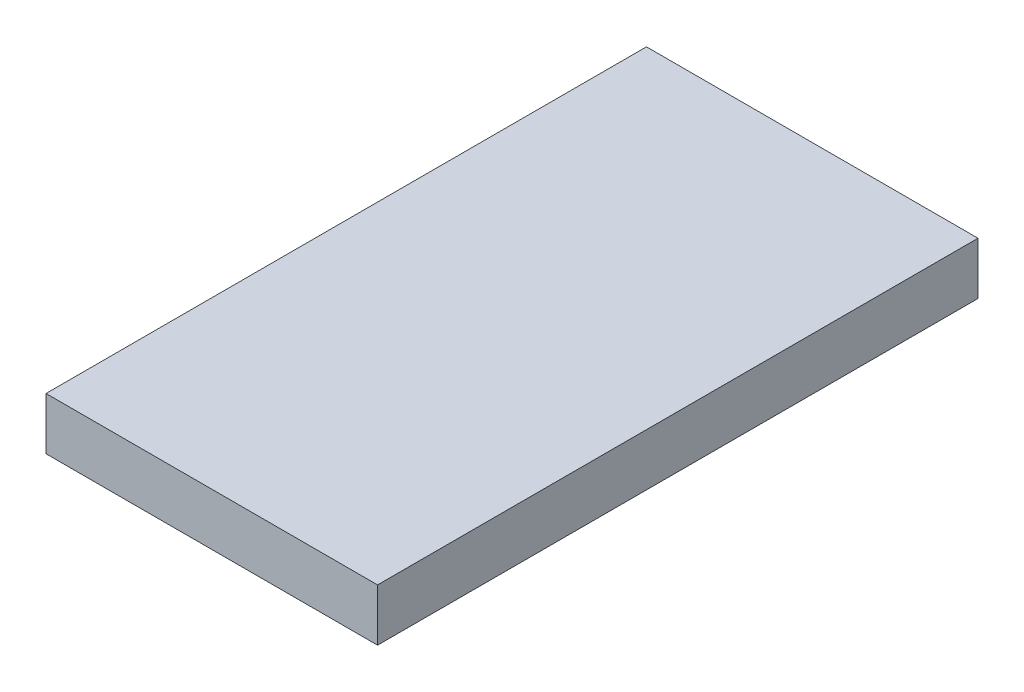
ISO-10303-21;
HEADER;
FILE_DESCRIPTION(('STEP AP214'),'2;1');
FILE_NAME('part.step','',(''),(''),'','','');
FILE_SCHEMA(('AUTOMOTIVE_DESIGN { 1 0 10303 214 1 1 1 1 }'));
ENDSEC;
DATA;
#1=APPLICATION_CONTEXT('core data for automotive mechanical design processes');
#2=APPLICATION_PROTOCOL_DEFINITION('international standard','automotive_design',2000,#1);
#3=PRODUCT_CONTEXT('',#1,'mechanical');
#4=PRODUCT('Part','Part','',(#3));
#5=PRODUCT_RELATED_PRODUCT_CATEGORY('part','',(#4));
#6=PRODUCT_DEFINITION_FORMATION('','',#4);
#7=PRODUCT_DEFINITION_CONTEXT('part definition',#1,'design');
#8=PRODUCT_DEFINITION('design','',#6,#7);
#9=PRODUCT_DEFINITION_SHAPE('','',#8);
#10=(LENGTH_UNIT() NAMED_UNIT(*) SI_UNIT(.MILLI.,.METRE.));
#11=(NAMED_UNIT(*) PLANE_ANGLE_UNIT() SI_UNIT($,.RADIAN.));
#12=(NAMED_UNIT(*) SI_UNIT($,.STERADIAN.) SOLID_ANGLE_UNIT());
#13=UNCERTAINTY_MEASURE_WITH_UNIT(LENGTH_MEASURE(1.E-05),#10,'distance_accuracy_value','');
#14=(GEOMETRIC_REPRESENTATION_CONTEXT(3) GLOBAL_UNCERTAINTY_ASSIGNED_CONTEXT((#13)) GLOBAL_UNIT_ASSIGNED_CONTEXT((#10,
#11,#12)) REPRESENTATION_CONTEXT('',''));
#15=CARTESIAN_POINT('',(0.,0.,0.));
#16=DIRECTION('',(0.,0.,1.));
#17=DIRECTION('',(1.,0.,0.));
#18=AXIS2_PLACEMENT_3D('',#15,#16,#17);
#19=CARTESIAN_POINT('',(0.,2.,0.));
#20=DIRECTION('',(1.,0.,0.));
#21=DIRECTION('',(0.,0.,-1.));
#22=AXIS2_PLACEMENT_3D('',#19,#20,#21);
#23=PLANE('',#22);
#24=DIRECTION('',(0.,0.,1.));
#25=VECTOR('',#24,1.);
#26=CARTESIAN_POINT('',(0.,0.,0.));
#27=LINE('',#26,#25);
#28=CARTESIAN_POINT('',(0.,0.,0.));
#29=VERTEX_POINT('',#28);
#30=CARTESIAN_POINT('',(0.,0.,23.));
#31=VERTEX_POINT('',#30);
#32=EDGE_CURVE('E104',#29,#31,#27,.T.);
#33=ORIENTED_EDGE('',*,*,#32,.T.);
#34=DIRECTION('',(0.,-1.,0.));
#35=VECTOR('',#34,1.);
#36=CARTESIAN_POINT('',(0.,2.,23.));
#37=LINE('',#36,#35);
#38=CARTESIAN_POINT('',(0.,2.,23.));
#39=VERTEX_POINT('',#38);
#40=EDGE_CURVE('E11',#39,#31,#37,.T.);
#41=ORIENTED_EDGE('',*,*,#40,.F.);
#42=DIRECTION('',(0.,0.,1.));
#43=VECTOR('',#42,1.);
#44=CARTESIAN_POINT('',(0.,2.,0.));
#45=LINE('',#44,#43);
#46=CARTESIAN_POINT('',(0.,2.,0.));
#47=VERTEX_POINT('',#46);
#48=EDGE_CURVE('E92',#47,#39,#45,.T.);
#49=ORIENTED_EDGE('',*,*,#48,.F.);
#50=DIRECTION('',(0.,-1.,0.));
#51=VECTOR('',#50,1.);
#52=CARTESIAN_POINT('',(0.,2.,0.));
#53=LINE('',#52,#51);
#54=EDGE_CURVE('E100',#47,#29,#53,.T.);
#55=ORIENTED_EDGE('',*,*,#54,.T.);
#56=EDGE_LOOP('',(#33,#41,#49,#55));
#57=FACE_BOUND('',#56,.T.);
#58=ADVANCED_FACE('F41',(#57),#23,.F.);
#59=CARTESIAN_POINT('',(0.,2.,23.));
#60=DIRECTION('',(0.,0.,-1.));
#61=DIRECTION('',(-1.,0.,0.));
#62=AXIS2_PLACEMENT_3D('',#59,#60,#61);
#63=PLANE('',#62);
#64=DIRECTION('',(1.,0.,0.));
#65=VECTOR('',#64,1.);
#66=CARTESIAN_POINT('',(0.,0.,23.));
#67=LINE('',#66,#65);
#68=CARTESIAN_POINT('',(12.7,0.,23.));
#69=VERTEX_POINT('',#68);
#70=EDGE_CURVE('E96',#31,#69,#67,.T.);
#71=ORIENTED_EDGE('',*,*,#70,.T.);
#72=DIRECTION('',(0.,-1.,0.));
#73=VECTOR('',#72,1.);
#74=CARTESIAN_POINT('',(12.7,2.,23.));
#75=LINE('',#74,#73);
#76=CARTESIAN_POINT('',(12.7,2.,23.));
#77=VERTEX_POINT('',#76);
#78=EDGE_CURVE('E49',#77,#69,#75,.T.);
#79=ORIENTED_EDGE('',*,*,#78,.F.);
#80=DIRECTION('',(1.,0.,0.));
#81=VECTOR('',#80,1.);
#82=CARTESIAN_POINT('',(0.,2.,23.));
#83=LINE('',#82,#81);
#84=EDGE_CURVE('E87',#39,#77,#83,.T.);
#85=ORIENTED_EDGE('',*,*,#84,.F.);
#86=ORIENTED_EDGE('',*,*,#40,.T.);
#87=EDGE_LOOP('',(#71,#79,#85,#86));
#88=FACE_BOUND('',#87,.T.);
#89=ADVANCED_FACE('F95',(#88),#63,.F.);
#90=CARTESIAN_POINT('',(12.7,2.,0.));
#91=DIRECTION('',(-1.,0.,0.));
#92=DIRECTION('',(0.,0.,1.));
#93=AXIS2_PLACEMENT_3D('',#90,#91,#92);
#94=PLANE('',#93);
#95=DIRECTION('',(0.,0.,-1.));
#96=VECTOR('',#95,1.);
#97=CARTESIAN_POINT('',(12.7,0.,0.));
#98=LINE('',#97,#96);
#99=CARTESIAN_POINT('',(12.7,0.,0.));
#100=VERTEX_POINT('',#99);
#101=EDGE_CURVE('E74',#69,#100,#98,.T.);
#102=ORIENTED_EDGE('',*,*,#101,.T.);
#103=DIRECTION('',(0.,-1.,0.));
#104=VECTOR('',#103,1.);
#105=CARTESIAN_POINT('',(12.7,2.,0.));
#106=LINE('',#105,#104);
#107=CARTESIAN_POINT('',(12.7,2.,0.));
#108=VERTEX_POINT('',#107);
#109=EDGE_CURVE('E97',#108,#100,#106,.T.);
#110=ORIENTED_EDGE('',*,*,#109,.F.);
#111=DIRECTION('',(0.,0.,-1.));
#112=VECTOR('',#111,1.);
#113=CARTESIAN_POINT('',(12.7,2.,0.));
#114=LINE('',#113,#112);
#115=EDGE_CURVE('E90',#77,#108,#114,.T.);
#116=ORIENTED_EDGE('',*,*,#115,.F.);
#117=ORIENTED_EDGE('',*,*,#78,.T.);
#118=EDGE_LOOP('',(#102,#110,#116,#117));
#119=FACE_BOUND('',#118,.T.);
#120=ADVANCED_FACE('F98',(#119),#94,.F.);
#121=CARTESIAN_POINT('',(0.,2.,0.));
#122=DIRECTION('',(0.,0.,1.));
#123=DIRECTION('',(1.,0.,0.));
#124=AXIS2_PLACEMENT_3D('',#121,#122,#123);
#125=PLANE('',#124);
#126=DIRECTION('',(-1.,0.,0.));
#127=VECTOR('',#126,1.);
#128=CARTESIAN_POINT('',(0.,0.,0.));
#129=LINE('',#128,#127);
#130=EDGE_CURVE('E80',#100,#29,#129,.T.);
#131=ORIENTED_EDGE('',*,*,#130,.T.);
#132=ORIENTED_EDGE('',*,*,#54,.F.);
#133=DIRECTION('',(-1.,0.,0.));
#134=VECTOR('',#133,1.);
#135=CARTESIAN_POINT('',(0.,2.,0.));
#136=LINE('',#135,#134);
#137=EDGE_CURVE('E57',#108,#47,#136,.T.);
#138=ORIENTED_EDGE('',*,*,#137,.F.);
#139=ORIENTED_EDGE('',*,*,#109,.T.);
#140=EDGE_LOOP('',(#131,#132,#138,#139));
#141=FACE_BOUND('',#140,.T.);
#142=ADVANCED_FACE('F111',(#141),#125,.F.);
#143=CARTESIAN_POINT('',(0.,2.,0.));
#144=DIRECTION('',(0.,1.,0.));
#145=DIRECTION('',(0.,0.,1.));
#146=AXIS2_PLACEMENT_3D('',#143,#144,#145);
#147=PLANE('',#146);
#148=ORIENTED_EDGE('',*,*,#48,.T.);
#149=ORIENTED_EDGE('',*,*,#84,.T.);
#150=ORIENTED_EDGE('',*,*,#115,.T.);
#151=ORIENTED_EDGE('',*,*,#137,.T.);
#152=EDGE_LOOP('',(#148,#149,#150,#151));
#153=FACE_BOUND('',#152,.T.);
#154=ADVANCED_FACE('F88',(#153),#147,.T.);
#155=CARTESIAN_POINT('',(0.,0.,0.));
#156=DIRECTION('',(0.,1.,0.));
#157=DIRECTION('',(0.,0.,1.));
#158=AXIS2_PLACEMENT_3D('',#155,#156,#157);
#159=PLANE('',#158);
#160=ORIENTED_EDGE('',*,*,#32,.F.);
#161=ORIENTED_EDGE('',*,*,#130,.F.);
#162=ORIENTED_EDGE('',*,*,#101,.F.);
#163=ORIENTED_EDGE('',*,*,#70,.F.);
#164=EDGE_LOOP('',(#160,#161,#162,#163));
#165=FACE_BOUND('',#164,.T.);
#166=ADVANCED_FACE('F114',(#165),#159,.F.);
#167=CLOSED_SHELL('',(#58,#89,#120,#142,#154,#166));
#168=MANIFOLD_SOLID_BREP('B2',#167);
#169=ADVANCED_BREP_SHAPE_REPRESENTATION('',(#18,#168),#14);
#170=SHAPE_DEFINITION_REPRESENTATION(#9,#169);
ENDSEC;
END-ISO-10303-21;
